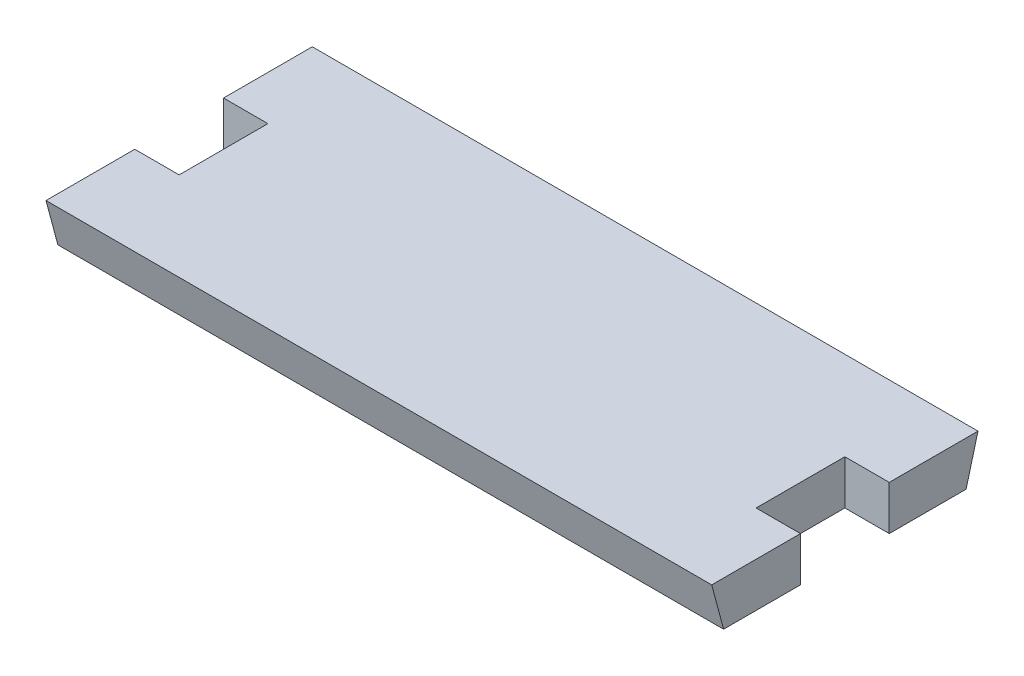
ISO-10303-21;
HEADER;
FILE_DESCRIPTION(('STEP AP214'),'2;1');
FILE_NAME('part.step','',(''),(''),'','','');
FILE_SCHEMA(('AUTOMOTIVE_DESIGN { 1 0 10303 214 1 1 1 1 }'));
ENDSEC;
DATA;
#1=APPLICATION_CONTEXT('core data for automotive mechanical design processes');
#2=APPLICATION_PROTOCOL_DEFINITION('international standard','automotive_design',2000,#1);
#3=PRODUCT_CONTEXT('',#1,'mechanical');
#4=PRODUCT('Part','Part','',(#3));
#5=PRODUCT_RELATED_PRODUCT_CATEGORY('part','',(#4));
#6=PRODUCT_DEFINITION_FORMATION('','',#4);
#7=PRODUCT_DEFINITION_CONTEXT('part definition',#1,'design');
#8=PRODUCT_DEFINITION('design','',#6,#7);
#9=PRODUCT_DEFINITION_SHAPE('','',#8);
#10=(LENGTH_UNIT() NAMED_UNIT(*) SI_UNIT(.MILLI.,.METRE.));
#11=(NAMED_UNIT(*) PLANE_ANGLE_UNIT() SI_UNIT($,.RADIAN.));
#12=(NAMED_UNIT(*) SI_UNIT($,.STERADIAN.) SOLID_ANGLE_UNIT());
#13=UNCERTAINTY_MEASURE_WITH_UNIT(LENGTH_MEASURE(1.E-05),#10,'distance_accuracy_value','');
#14=(GEOMETRIC_REPRESENTATION_CONTEXT(3) GLOBAL_UNCERTAINTY_ASSIGNED_CONTEXT((#13)) GLOBAL_UNIT_ASSIGNED_CONTEXT((#10,
#11,#12)) REPRESENTATION_CONTEXT('',''));
#15=CARTESIAN_POINT('',(0.,0.,0.));
#16=DIRECTION('',(0.,0.,1.));
#17=DIRECTION('',(1.,0.,0.));
#18=AXIS2_PLACEMENT_3D('',#15,#16,#17);
#19=CARTESIAN_POINT('',(75.,10.,30.));
#20=DIRECTION('',(-1.,0.,0.));
#21=DIRECTION('',(0.,0.,1.));
#22=AXIS2_PLACEMENT_3D('',#19,#20,#21);
#23=PLANE('',#22);
#24=DIRECTION('',(0.,-1.,0.));
#25=VECTOR('',#24,1.);
#26=CARTESIAN_POINT('',(75.,10.,-10.));
#27=LINE('',#26,#25);
#28=CARTESIAN_POINT('',(75.,10.,-10.));
#29=VERTEX_POINT('',#28);
#30=CARTESIAN_POINT('',(75.,0.,-10.));
#31=VERTEX_POINT('',#30);
#32=EDGE_CURVE('E176',#29,#31,#27,.T.);
#33=ORIENTED_EDGE('',*,*,#32,.T.);
#34=DIRECTION('',(0.,0.,-1.));
#35=VECTOR('',#34,1.);
#36=CARTESIAN_POINT('',(75.,0.,30.));
#37=LINE('',#36,#35);
#38=CARTESIAN_POINT('',(75.,0.,-27.3205080756888));
#39=VERTEX_POINT('',#38);
#40=EDGE_CURVE('E160',#31,#39,#37,.T.);
#41=ORIENTED_EDGE('',*,*,#40,.T.);
#42=DIRECTION('',(0.,0.965925826289068,-0.258819045102521));
#43=VECTOR('',#42,1.);
#44=CARTESIAN_POINT('',(75.,10.,-30.));
#45=LINE('',#44,#43);
#46=CARTESIAN_POINT('',(75.,10.,-30.));
#47=VERTEX_POINT('',#46);
#48=EDGE_CURVE('E163',#47,#39,#45,.F.);
#49=ORIENTED_EDGE('',*,*,#48,.F.);
#50=DIRECTION('',(0.,0.,-1.));
#51=VECTOR('',#50,1.);
#52=CARTESIAN_POINT('',(75.,10.,30.));
#53=LINE('',#52,#51);
#54=EDGE_CURVE('E146',#29,#47,#53,.T.);
#55=ORIENTED_EDGE('',*,*,#54,.F.);
#56=EDGE_LOOP('',(#33,#41,#49,#55));
#57=FACE_BOUND('',#56,.T.);
#58=ADVANCED_FACE('F32',(#57),#23,.F.);
#59=DIRECTION('',(0.,-1.,0.));
#60=VECTOR('',#59,1.);
#61=CARTESIAN_POINT('',(75.,10.,9.99999999999999));
#62=LINE('',#61,#60);
#63=CARTESIAN_POINT('',(75.,10.,9.99999999999999));
#64=VERTEX_POINT('',#63);
#65=CARTESIAN_POINT('',(75.,0.,9.99999999999999));
#66=VERTEX_POINT('',#65);
#67=EDGE_CURVE('E47',#64,#66,#62,.T.);
#68=ORIENTED_EDGE('',*,*,#67,.F.);
#69=CARTESIAN_POINT('',(75.,10.,30.));
#70=VERTEX_POINT('',#69);
#71=EDGE_CURVE('E136',#70,#64,#53,.T.);
#72=ORIENTED_EDGE('',*,*,#71,.F.);
#73=DIRECTION('',(0.,0.965925826289068,0.258819045102521));
#74=VECTOR('',#73,1.);
#75=CARTESIAN_POINT('',(75.,10.,30.));
#76=LINE('',#75,#74);
#77=CARTESIAN_POINT('',(75.,0.,27.3205080756888));
#78=VERTEX_POINT('',#77);
#79=EDGE_CURVE('E36',#70,#78,#76,.F.);
#80=ORIENTED_EDGE('',*,*,#79,.T.);
#81=EDGE_CURVE('E138',#78,#66,#37,.T.);
#82=ORIENTED_EDGE('',*,*,#81,.T.);
#83=EDGE_LOOP('',(#68,#72,#80,#82));
#84=FACE_BOUND('',#83,.T.);
#85=ADVANCED_FACE('F134',(#84),#23,.F.);
#86=CARTESIAN_POINT('',(0.,10.,0.));
#87=DIRECTION('',(0.,1.,0.));
#88=DIRECTION('',(0.,0.,1.));
#89=AXIS2_PLACEMENT_3D('',#86,#87,#88);
#90=PLANE('',#89);
#91=DIRECTION('',(0.,0.,1.));
#92=VECTOR('',#91,1.);
#93=CARTESIAN_POINT('',(65.,10.,-10.));
#94=LINE('',#93,#92);
#95=CARTESIAN_POINT('',(65.,10.,-10.));
#96=VERTEX_POINT('',#95);
#97=CARTESIAN_POINT('',(65.,10.,9.99999999999999));
#98=VERTEX_POINT('',#97);
#99=EDGE_CURVE('E128',#96,#98,#94,.T.);
#100=ORIENTED_EDGE('',*,*,#99,.F.);
#101=DIRECTION('',(-1.,0.,0.));
#102=VECTOR('',#101,1.);
#103=CARTESIAN_POINT('',(75.,10.,-10.));
#104=LINE('',#103,#102);
#105=EDGE_CURVE('E139',#29,#96,#104,.T.);
#106=ORIENTED_EDGE('',*,*,#105,.F.);
#107=ORIENTED_EDGE('',*,*,#54,.T.);
#108=DIRECTION('',(-1.,0.,0.));
#109=VECTOR('',#108,1.);
#110=CARTESIAN_POINT('',(75.,10.,-30.));
#111=LINE('',#110,#109);
#112=CARTESIAN_POINT('',(-75.,10.,-30.));
#113=VERTEX_POINT('',#112);
#114=EDGE_CURVE('E145',#47,#113,#111,.T.);
#115=ORIENTED_EDGE('',*,*,#114,.T.);
#116=DIRECTION('',(0.,0.,1.));
#117=VECTOR('',#116,1.);
#118=CARTESIAN_POINT('',(-75.,10.,30.));
#119=LINE('',#118,#117);
#120=CARTESIAN_POINT('',(-75.,10.,-10.));
#121=VERTEX_POINT('',#120);
#122=EDGE_CURVE('E191',#113,#121,#119,.T.);
#123=ORIENTED_EDGE('',*,*,#122,.T.);
#124=DIRECTION('',(1.,0.,0.));
#125=VECTOR('',#124,1.);
#126=CARTESIAN_POINT('',(-75.,10.,-10.));
#127=LINE('',#126,#125);
#128=CARTESIAN_POINT('',(-65.,10.,-10.));
#129=VERTEX_POINT('',#128);
#130=EDGE_CURVE('E205',#121,#129,#127,.T.);
#131=ORIENTED_EDGE('',*,*,#130,.T.);
#132=DIRECTION('',(0.,0.,1.));
#133=VECTOR('',#132,1.);
#134=CARTESIAN_POINT('',(-65.,10.,-10.));
#135=LINE('',#134,#133);
#136=CARTESIAN_POINT('',(-65.,10.,9.99999999999999));
#137=VERTEX_POINT('',#136);
#138=EDGE_CURVE('E212',#129,#137,#135,.T.);
#139=ORIENTED_EDGE('',*,*,#138,.T.);
#140=DIRECTION('',(-1.,0.,0.));
#141=VECTOR('',#140,1.);
#142=CARTESIAN_POINT('',(-65.,10.,9.99999999999999));
#143=LINE('',#142,#141);
#144=CARTESIAN_POINT('',(-75.,10.,9.99999999999999));
#145=VERTEX_POINT('',#144);
#146=EDGE_CURVE('E196',#137,#145,#143,.T.);
#147=ORIENTED_EDGE('',*,*,#146,.T.);
#148=CARTESIAN_POINT('',(-75.,10.,30.));
#149=VERTEX_POINT('',#148);
#150=EDGE_CURVE('E162',#145,#149,#119,.T.);
#151=ORIENTED_EDGE('',*,*,#150,.T.);
#152=DIRECTION('',(1.,0.,0.));
#153=VECTOR('',#152,1.);
#154=CARTESIAN_POINT('',(75.,10.,30.));
#155=LINE('',#154,#153);
#156=EDGE_CURVE('E143',#149,#70,#155,.T.);
#157=ORIENTED_EDGE('',*,*,#156,.T.);
#158=ORIENTED_EDGE('',*,*,#71,.T.);
#159=DIRECTION('',(1.,0.,0.));
#160=VECTOR('',#159,1.);
#161=CARTESIAN_POINT('',(65.,10.,9.99999999999999));
#162=LINE('',#161,#160);
#163=EDGE_CURVE('E122',#98,#64,#162,.T.);
#164=ORIENTED_EDGE('',*,*,#163,.F.);
#165=EDGE_LOOP('',(#100,#106,#107,#115,#123,#131,#139,#147,#151,#157,#158,#164));
#166=FACE_BOUND('',#165,.T.);
#167=ADVANCED_FACE('F141',(#166),#90,.T.);
#168=CARTESIAN_POINT('',(0.,0.,0.));
#169=DIRECTION('',(0.,1.,0.));
#170=DIRECTION('',(0.,0.,1.));
#171=AXIS2_PLACEMENT_3D('',#168,#169,#170);
#172=PLANE('',#171);
#173=DIRECTION('',(-1.,0.,0.));
#174=VECTOR('',#173,1.);
#175=CARTESIAN_POINT('',(75.,0.,-10.));
#176=LINE('',#175,#174);
#177=CARTESIAN_POINT('',(65.,0.,-10.));
#178=VERTEX_POINT('',#177);
#179=EDGE_CURVE('E129',#31,#178,#176,.T.);
#180=ORIENTED_EDGE('',*,*,#179,.T.);
#181=DIRECTION('',(0.,0.,1.));
#182=VECTOR('',#181,1.);
#183=CARTESIAN_POINT('',(65.,0.,-10.));
#184=LINE('',#183,#182);
#185=CARTESIAN_POINT('',(65.,0.,9.99999999999999));
#186=VERTEX_POINT('',#185);
#187=EDGE_CURVE('E221',#178,#186,#184,.T.);
#188=ORIENTED_EDGE('',*,*,#187,.T.);
#189=DIRECTION('',(1.,0.,0.));
#190=VECTOR('',#189,1.);
#191=CARTESIAN_POINT('',(65.,0.,9.99999999999999));
#192=LINE('',#191,#190);
#193=EDGE_CURVE('E224',#186,#66,#192,.T.);
#194=ORIENTED_EDGE('',*,*,#193,.T.);
#195=ORIENTED_EDGE('',*,*,#81,.F.);
#196=DIRECTION('',(-1.,0.,0.));
#197=VECTOR('',#196,1.);
#198=CARTESIAN_POINT('',(75.,0.,27.3205080756888));
#199=LINE('',#198,#197);
#200=CARTESIAN_POINT('',(-75.,0.,27.3205080756888));
#201=VERTEX_POINT('',#200);
#202=EDGE_CURVE('E156',#201,#78,#199,.F.);
#203=ORIENTED_EDGE('',*,*,#202,.F.);
#204=DIRECTION('',(0.,0.,1.));
#205=VECTOR('',#204,1.);
#206=CARTESIAN_POINT('',(-75.,0.,30.));
#207=LINE('',#206,#205);
#208=CARTESIAN_POINT('',(-75.,0.,9.99999999999999));
#209=VERTEX_POINT('',#208);
#210=EDGE_CURVE('E157',#209,#201,#207,.T.);
#211=ORIENTED_EDGE('',*,*,#210,.F.);
#212=DIRECTION('',(-1.,0.,0.));
#213=VECTOR('',#212,1.);
#214=CARTESIAN_POINT('',(-65.,0.,9.99999999999999));
#215=LINE('',#214,#213);
#216=CARTESIAN_POINT('',(-65.,0.,9.99999999999999));
#217=VERTEX_POINT('',#216);
#218=EDGE_CURVE('E203',#217,#209,#215,.T.);
#219=ORIENTED_EDGE('',*,*,#218,.F.);
#220=DIRECTION('',(0.,0.,1.));
#221=VECTOR('',#220,1.);
#222=CARTESIAN_POINT('',(-65.,0.,-10.));
#223=LINE('',#222,#221);
#224=CARTESIAN_POINT('',(-65.,0.,-10.));
#225=VERTEX_POINT('',#224);
#226=EDGE_CURVE('E206',#225,#217,#223,.T.);
#227=ORIENTED_EDGE('',*,*,#226,.F.);
#228=DIRECTION('',(1.,0.,0.));
#229=VECTOR('',#228,1.);
#230=CARTESIAN_POINT('',(-75.,0.,-10.));
#231=LINE('',#230,#229);
#232=CARTESIAN_POINT('',(-75.,0.,-10.));
#233=VERTEX_POINT('',#232);
#234=EDGE_CURVE('E186',#233,#225,#231,.T.);
#235=ORIENTED_EDGE('',*,*,#234,.F.);
#236=CARTESIAN_POINT('',(-75.,0.,-27.3205080756888));
#237=VERTEX_POINT('',#236);
#238=EDGE_CURVE('E153',#237,#233,#207,.T.);
#239=ORIENTED_EDGE('',*,*,#238,.F.);
#240=DIRECTION('',(1.,0.,0.));
#241=VECTOR('',#240,1.);
#242=CARTESIAN_POINT('',(75.,0.,-27.3205080756888));
#243=LINE('',#242,#241);
#244=EDGE_CURVE('E159',#39,#237,#243,.F.);
#245=ORIENTED_EDGE('',*,*,#244,.F.);
#246=ORIENTED_EDGE('',*,*,#40,.F.);
#247=EDGE_LOOP('',(#180,#188,#194,#195,#203,#211,#219,#227,#235,#239,#245,#246));
#248=FACE_BOUND('',#247,.T.);
#249=ADVANCED_FACE('F184',(#248),#172,.F.);
#250=CARTESIAN_POINT('',(-75.,10.,30.));
#251=DIRECTION('',(1.,0.,0.));
#252=DIRECTION('',(0.,0.,-1.));
#253=AXIS2_PLACEMENT_3D('',#250,#251,#252);
#254=PLANE('',#253);
#255=ORIENTED_EDGE('',*,*,#150,.F.);
#256=DIRECTION('',(0.,-1.,0.));
#257=VECTOR('',#256,1.);
#258=CARTESIAN_POINT('',(-75.,10.,9.99999999999999));
#259=LINE('',#258,#257);
#260=EDGE_CURVE('E200',#145,#209,#259,.T.);
#261=ORIENTED_EDGE('',*,*,#260,.T.);
#262=ORIENTED_EDGE('',*,*,#210,.T.);
#263=DIRECTION('',(0.,0.965925826289068,0.258819045102521));
#264=VECTOR('',#263,1.);
#265=CARTESIAN_POINT('',(-75.,9.99999999999999,30.));
#266=LINE('',#265,#264);
#267=EDGE_CURVE('E11',#149,#201,#266,.F.);
#268=ORIENTED_EDGE('',*,*,#267,.F.);
#269=EDGE_LOOP('',(#255,#261,#262,#268));
#270=FACE_BOUND('',#269,.T.);
#271=ADVANCED_FACE('F239',(#270),#254,.F.);
#272=ORIENTED_EDGE('',*,*,#238,.T.);
#273=DIRECTION('',(0.,-1.,0.));
#274=VECTOR('',#273,1.);
#275=CARTESIAN_POINT('',(-75.,10.,-10.));
#276=LINE('',#275,#274);
#277=EDGE_CURVE('E55',#121,#233,#276,.T.);
#278=ORIENTED_EDGE('',*,*,#277,.F.);
#279=ORIENTED_EDGE('',*,*,#122,.F.);
#280=DIRECTION('',(0.,0.965925826289068,-0.258819045102521));
#281=VECTOR('',#280,1.);
#282=CARTESIAN_POINT('',(-75.,-5.00000000000003,-25.9807621135331));
#283=LINE('',#282,#281);
#284=EDGE_CURVE('E148',#113,#237,#283,.F.);
#285=ORIENTED_EDGE('',*,*,#284,.T.);
#286=EDGE_LOOP('',(#272,#278,#279,#285));
#287=FACE_BOUND('',#286,.T.);
#288=ADVANCED_FACE('F188',(#287),#254,.F.);
#289=CARTESIAN_POINT('',(75.,10.,30.));
#290=DIRECTION('',(0.,-0.258819045102521,0.965925826289068));
#291=DIRECTION('',(0.,-0.965925826289068,-0.258819045102521));
#292=AXIS2_PLACEMENT_3D('',#289,#290,#291);
#293=PLANE('',#292);
#294=ORIENTED_EDGE('',*,*,#202,.T.);
#295=ORIENTED_EDGE('',*,*,#79,.F.);
#296=ORIENTED_EDGE('',*,*,#156,.F.);
#297=ORIENTED_EDGE('',*,*,#267,.T.);
#298=EDGE_LOOP('',(#294,#295,#296,#297));
#299=FACE_BOUND('',#298,.T.);
#300=ADVANCED_FACE('F34',(#299),#293,.T.);
#301=CARTESIAN_POINT('',(75.,10.,-30.));
#302=DIRECTION('',(0.,-0.258819045102521,-0.965925826289068));
#303=DIRECTION('',(0.,0.965925826289068,-0.258819045102521));
#304=AXIS2_PLACEMENT_3D('',#301,#302,#303);
#305=PLANE('',#304);
#306=ORIENTED_EDGE('',*,*,#244,.T.);
#307=ORIENTED_EDGE('',*,*,#284,.F.);
#308=ORIENTED_EDGE('',*,*,#114,.F.);
#309=ORIENTED_EDGE('',*,*,#48,.T.);
#310=EDGE_LOOP('',(#306,#307,#308,#309));
#311=FACE_BOUND('',#310,.T.);
#312=ADVANCED_FACE('F181',(#311),#305,.T.);
#313=CARTESIAN_POINT('',(-65.,10.,9.99999999999999));
#314=DIRECTION('',(0.,0.,1.));
#315=DIRECTION('',(1.,0.,0.));
#316=AXIS2_PLACEMENT_3D('',#313,#314,#315);
#317=PLANE('',#316);
#318=ORIENTED_EDGE('',*,*,#218,.T.);
#319=ORIENTED_EDGE('',*,*,#260,.F.);
#320=ORIENTED_EDGE('',*,*,#146,.F.);
#321=DIRECTION('',(0.,-1.,0.));
#322=VECTOR('',#321,1.);
#323=CARTESIAN_POINT('',(-65.,10.,9.99999999999999));
#324=LINE('',#323,#322);
#325=EDGE_CURVE('E198',#137,#217,#324,.T.);
#326=ORIENTED_EDGE('',*,*,#325,.T.);
#327=EDGE_LOOP('',(#318,#319,#320,#326));
#328=FACE_BOUND('',#327,.T.);
#329=ADVANCED_FACE('F242',(#328),#317,.F.);
#330=CARTESIAN_POINT('',(-65.,10.,-10.));
#331=DIRECTION('',(1.,0.,0.));
#332=DIRECTION('',(0.,0.,-1.));
#333=AXIS2_PLACEMENT_3D('',#330,#331,#332);
#334=PLANE('',#333);
#335=ORIENTED_EDGE('',*,*,#226,.T.);
#336=ORIENTED_EDGE('',*,*,#325,.F.);
#337=ORIENTED_EDGE('',*,*,#138,.F.);
#338=DIRECTION('',(0.,-1.,0.));
#339=VECTOR('',#338,1.);
#340=CARTESIAN_POINT('',(-65.,10.,-10.));
#341=LINE('',#340,#339);
#342=EDGE_CURVE('E195',#129,#225,#341,.T.);
#343=ORIENTED_EDGE('',*,*,#342,.T.);
#344=EDGE_LOOP('',(#335,#336,#337,#343));
#345=FACE_BOUND('',#344,.T.);
#346=ADVANCED_FACE('F245',(#345),#334,.F.);
#347=CARTESIAN_POINT('',(-75.,10.,-10.));
#348=DIRECTION('',(0.,0.,-1.));
#349=DIRECTION('',(-1.,0.,0.));
#350=AXIS2_PLACEMENT_3D('',#347,#348,#349);
#351=PLANE('',#350);
#352=ORIENTED_EDGE('',*,*,#234,.T.);
#353=ORIENTED_EDGE('',*,*,#342,.F.);
#354=ORIENTED_EDGE('',*,*,#130,.F.);
#355=ORIENTED_EDGE('',*,*,#277,.T.);
#356=EDGE_LOOP('',(#352,#353,#354,#355));
#357=FACE_BOUND('',#356,.T.);
#358=ADVANCED_FACE('F246',(#357),#351,.F.);
#359=CARTESIAN_POINT('',(75.,10.,-10.));
#360=DIRECTION('',(0.,0.,1.));
#361=DIRECTION('',(1.,0.,0.));
#362=AXIS2_PLACEMENT_3D('',#359,#360,#361);
#363=PLANE('',#362);
#364=ORIENTED_EDGE('',*,*,#179,.F.);
#365=ORIENTED_EDGE('',*,*,#32,.F.);
#366=ORIENTED_EDGE('',*,*,#105,.T.);
#367=DIRECTION('',(0.,-1.,0.));
#368=VECTOR('',#367,1.);
#369=CARTESIAN_POINT('',(65.,10.,-10.));
#370=LINE('',#369,#368);
#371=EDGE_CURVE('E217',#96,#178,#370,.T.);
#372=ORIENTED_EDGE('',*,*,#371,.T.);
#373=EDGE_LOOP('',(#364,#365,#366,#372));
#374=FACE_BOUND('',#373,.T.);
#375=ADVANCED_FACE('F233',(#374),#363,.T.);
#376=CARTESIAN_POINT('',(65.,10.,-10.));
#377=DIRECTION('',(1.,0.,0.));
#378=DIRECTION('',(0.,0.,-1.));
#379=AXIS2_PLACEMENT_3D('',#376,#377,#378);
#380=PLANE('',#379);
#381=ORIENTED_EDGE('',*,*,#187,.F.);
#382=ORIENTED_EDGE('',*,*,#371,.F.);
#383=ORIENTED_EDGE('',*,*,#99,.T.);
#384=DIRECTION('',(0.,-1.,0.));
#385=VECTOR('',#384,1.);
#386=CARTESIAN_POINT('',(65.,10.,9.99999999999999));
#387=LINE('',#386,#385);
#388=EDGE_CURVE('E124',#98,#186,#387,.T.);
#389=ORIENTED_EDGE('',*,*,#388,.T.);
#390=EDGE_LOOP('',(#381,#382,#383,#389));
#391=FACE_BOUND('',#390,.T.);
#392=ADVANCED_FACE('F230',(#391),#380,.T.);
#393=CARTESIAN_POINT('',(65.,10.,9.99999999999999));
#394=DIRECTION('',(0.,0.,-1.));
#395=DIRECTION('',(-1.,0.,0.));
#396=AXIS2_PLACEMENT_3D('',#393,#394,#395);
#397=PLANE('',#396);
#398=ORIENTED_EDGE('',*,*,#193,.F.);
#399=ORIENTED_EDGE('',*,*,#388,.F.);
#400=ORIENTED_EDGE('',*,*,#163,.T.);
#401=ORIENTED_EDGE('',*,*,#67,.T.);
#402=EDGE_LOOP('',(#398,#399,#400,#401));
#403=FACE_BOUND('',#402,.T.);
#404=ADVANCED_FACE('F123',(#403),#397,.T.);
#405=CLOSED_SHELL('',(#58,#85,#167,#249,#271,#288,#300,#312,#329,#346,#358,#375,#392,#404));
#406=MANIFOLD_SOLID_BREP('B2',#405);
#407=ADVANCED_BREP_SHAPE_REPRESENTATION('',(#18,#406),#14);
#408=SHAPE_DEFINITION_REPRESENTATION(#9,#407);
ENDSEC;
END-ISO-10303-21;
